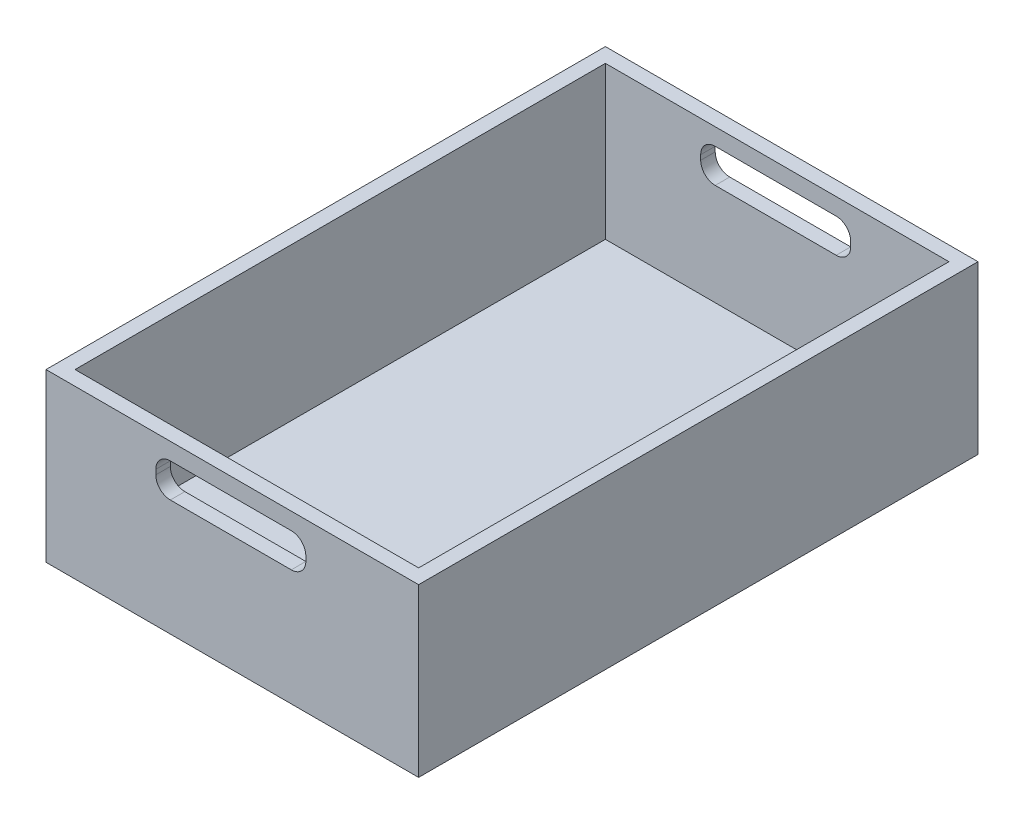
ISO-10303-21;
HEADER;
FILE_DESCRIPTION(('STEP AP214'),'2;1');
FILE_NAME('part.step','',(''),(''),'','','');
FILE_SCHEMA(('AUTOMOTIVE_DESIGN { 1 0 10303 214 1 1 1 1 }'));
ENDSEC;
DATA;
#1=APPLICATION_CONTEXT('core data for automotive mechanical design processes');
#2=APPLICATION_PROTOCOL_DEFINITION('international standard','automotive_design',2000,#1);
#3=PRODUCT_CONTEXT('',#1,'mechanical');
#4=PRODUCT('Part','Part','',(#3));
#5=PRODUCT_RELATED_PRODUCT_CATEGORY('part','',(#4));
#6=PRODUCT_DEFINITION_FORMATION('','',#4);
#7=PRODUCT_DEFINITION_CONTEXT('part definition',#1,'design');
#8=PRODUCT_DEFINITION('design','',#6,#7);
#9=PRODUCT_DEFINITION_SHAPE('','',#8);
#10=(LENGTH_UNIT() NAMED_UNIT(*) SI_UNIT(.MILLI.,.METRE.));
#11=(NAMED_UNIT(*) PLANE_ANGLE_UNIT() SI_UNIT($,.RADIAN.));
#12=(NAMED_UNIT(*) SI_UNIT($,.STERADIAN.) SOLID_ANGLE_UNIT());
#13=UNCERTAINTY_MEASURE_WITH_UNIT(LENGTH_MEASURE(1.E-05),#10,'distance_accuracy_value','');
#14=(GEOMETRIC_REPRESENTATION_CONTEXT(3) GLOBAL_UNCERTAINTY_ASSIGNED_CONTEXT((#13)) GLOBAL_UNIT_ASSIGNED_CONTEXT((#10,
#11,#12)) REPRESENTATION_CONTEXT('',''));
#15=CARTESIAN_POINT('',(0.,0.,0.));
#16=DIRECTION('',(0.,0.,1.));
#17=DIRECTION('',(1.,0.,0.));
#18=AXIS2_PLACEMENT_3D('',#15,#16,#17);
#19=CARTESIAN_POINT('',(0.,15.,0.));
#20=DIRECTION('',(0.,-1.,0.));
#21=DIRECTION('',(0.,0.,-1.));
#22=AXIS2_PLACEMENT_3D('',#19,#20,#21);
#23=PLANE('',#22);
#24=DIRECTION('',(0.,0.,1.));
#25=VECTOR('',#24,1.);
#26=CARTESIAN_POINT('',(177.5,15.,289.));
#27=LINE('',#26,#25);
#28=CARTESIAN_POINT('',(177.5,15.,-274.));
#29=VERTEX_POINT('',#28);
#30=CARTESIAN_POINT('',(177.5,15.,274.));
#31=VERTEX_POINT('',#30);
#32=EDGE_CURVE('E243',#29,#31,#27,.T.);
#33=ORIENTED_EDGE('',*,*,#32,.F.);
#34=DIRECTION('',(-1.,0.,0.));
#35=VECTOR('',#34,1.);
#36=CARTESIAN_POINT('',(-177.5,15.,-274.));
#37=LINE('',#36,#35);
#38=CARTESIAN_POINT('',(-177.5,15.,-274.));
#39=VERTEX_POINT('',#38);
#40=EDGE_CURVE('E218',#29,#39,#37,.T.);
#41=ORIENTED_EDGE('',*,*,#40,.T.);
#42=DIRECTION('',(0.,0.,1.));
#43=VECTOR('',#42,1.);
#44=CARTESIAN_POINT('',(-177.5,15.,289.));
#45=LINE('',#44,#43);
#46=CARTESIAN_POINT('',(-177.5,15.,274.));
#47=VERTEX_POINT('',#46);
#48=EDGE_CURVE('E237',#39,#47,#45,.T.);
#49=ORIENTED_EDGE('',*,*,#48,.T.);
#50=DIRECTION('',(-1.,0.,0.));
#51=VECTOR('',#50,1.);
#52=CARTESIAN_POINT('',(-177.5,15.,274.));
#53=LINE('',#52,#51);
#54=EDGE_CURVE('E225',#31,#47,#53,.T.);
#55=ORIENTED_EDGE('',*,*,#54,.F.);
#56=EDGE_LOOP('',(#33,#41,#49,#55));
#57=FACE_BOUND('',#56,.T.);
#58=ADVANCED_FACE('F33',(#57),#23,.F.);
#59=CARTESIAN_POINT('',(177.5,172.5,289.));
#60=DIRECTION('',(1.,0.,0.));
#61=DIRECTION('',(0.,0.,-1.));
#62=AXIS2_PLACEMENT_3D('',#59,#60,#61);
#63=PLANE('',#62);
#64=DIRECTION('',(0.,0.,1.));
#65=VECTOR('',#64,1.);
#66=CARTESIAN_POINT('',(177.5,172.5,289.));
#67=LINE('',#66,#65);
#68=CARTESIAN_POINT('',(177.5,172.5,-274.));
#69=VERTEX_POINT('',#68);
#70=CARTESIAN_POINT('',(177.5,172.5,274.));
#71=VERTEX_POINT('',#70);
#72=EDGE_CURVE('E250',#69,#71,#67,.T.);
#73=ORIENTED_EDGE('',*,*,#72,.F.);
#74=DIRECTION('',(0.,-1.,0.));
#75=VECTOR('',#74,1.);
#76=CARTESIAN_POINT('',(177.5,172.5,-274.));
#77=LINE('',#76,#75);
#78=EDGE_CURVE('E217',#69,#29,#77,.T.);
#79=ORIENTED_EDGE('',*,*,#78,.T.);
#80=ORIENTED_EDGE('',*,*,#32,.T.);
#81=DIRECTION('',(0.,-1.,0.));
#82=VECTOR('',#81,1.);
#83=CARTESIAN_POINT('',(177.5,172.5,274.));
#84=LINE('',#83,#82);
#85=EDGE_CURVE('E234',#71,#31,#84,.T.);
#86=ORIENTED_EDGE('',*,*,#85,.F.);
#87=EDGE_LOOP('',(#73,#79,#80,#86));
#88=FACE_BOUND('',#87,.T.);
#89=ADVANCED_FACE('F436',(#88),#63,.F.);
#90=CARTESIAN_POINT('',(-177.5,172.5,289.));
#91=DIRECTION('',(1.,0.,0.));
#92=DIRECTION('',(0.,0.,-1.));
#93=AXIS2_PLACEMENT_3D('',#90,#91,#92);
#94=PLANE('',#93);
#95=DIRECTION('',(0.,-1.,0.));
#96=VECTOR('',#95,1.);
#97=CARTESIAN_POINT('',(-177.5,172.5,-274.));
#98=LINE('',#97,#96);
#99=CARTESIAN_POINT('',(-177.5,172.5,-274.));
#100=VERTEX_POINT('',#99);
#101=EDGE_CURVE('E223',#100,#39,#98,.T.);
#102=ORIENTED_EDGE('',*,*,#101,.F.);
#103=DIRECTION('',(0.,0.,1.));
#104=VECTOR('',#103,1.);
#105=CARTESIAN_POINT('',(-177.5,172.5,289.));
#106=LINE('',#105,#104);
#107=CARTESIAN_POINT('',(-177.5,172.5,274.));
#108=VERTEX_POINT('',#107);
#109=EDGE_CURVE('E241',#100,#108,#106,.T.);
#110=ORIENTED_EDGE('',*,*,#109,.T.);
#111=DIRECTION('',(0.,-1.,0.));
#112=VECTOR('',#111,1.);
#113=CARTESIAN_POINT('',(-177.5,172.5,274.));
#114=LINE('',#113,#112);
#115=EDGE_CURVE('E229',#108,#47,#114,.T.);
#116=ORIENTED_EDGE('',*,*,#115,.T.);
#117=ORIENTED_EDGE('',*,*,#48,.F.);
#118=EDGE_LOOP('',(#102,#110,#116,#117));
#119=FACE_BOUND('',#118,.T.);
#120=ADVANCED_FACE('F442',(#119),#94,.T.);
#121=CARTESIAN_POINT('',(192.5,15.,289.));
#122=DIRECTION('',(-1.,0.,0.));
#123=DIRECTION('',(0.,0.,1.));
#124=AXIS2_PLACEMENT_3D('',#121,#122,#123);
#125=PLANE('',#124);
#126=DIRECTION('',(0.,0.,-1.));
#127=VECTOR('',#126,1.);
#128=CARTESIAN_POINT('',(192.5,0.,289.));
#129=LINE('',#128,#127);
#130=CARTESIAN_POINT('',(192.5,0.,289.));
#131=VERTEX_POINT('',#130);
#132=CARTESIAN_POINT('',(192.5,0.,-289.));
#133=VERTEX_POINT('',#132);
#134=EDGE_CURVE('E255',#131,#133,#129,.T.);
#135=ORIENTED_EDGE('',*,*,#134,.T.);
#136=DIRECTION('',(0.,-1.,0.));
#137=VECTOR('',#136,1.);
#138=CARTESIAN_POINT('',(192.5,15.,-289.));
#139=LINE('',#138,#137);
#140=CARTESIAN_POINT('',(192.5,172.5,-289.));
#141=VERTEX_POINT('',#140);
#142=EDGE_CURVE('E274',#141,#133,#139,.T.);
#143=ORIENTED_EDGE('',*,*,#142,.F.);
#144=DIRECTION('',(0.,0.,-1.));
#145=VECTOR('',#144,1.);
#146=CARTESIAN_POINT('',(192.5,172.5,289.));
#147=LINE('',#146,#145);
#148=CARTESIAN_POINT('',(192.5,172.5,289.));
#149=VERTEX_POINT('',#148);
#150=EDGE_CURVE('E245',#149,#141,#147,.T.);
#151=ORIENTED_EDGE('',*,*,#150,.F.);
#152=DIRECTION('',(0.,-1.,0.));
#153=VECTOR('',#152,1.);
#154=CARTESIAN_POINT('',(192.5,15.,289.));
#155=LINE('',#154,#153);
#156=EDGE_CURVE('E265',#149,#131,#155,.T.);
#157=ORIENTED_EDGE('',*,*,#156,.T.);
#158=EDGE_LOOP('',(#135,#143,#151,#157));
#159=FACE_BOUND('',#158,.T.);
#160=ADVANCED_FACE('F35',(#159),#125,.F.);
#161=CARTESIAN_POINT('',(-192.5,15.,-289.));
#162=DIRECTION('',(0.,0.,1.));
#163=DIRECTION('',(1.,0.,0.));
#164=AXIS2_PLACEMENT_3D('',#161,#162,#163);
#165=PLANE('',#164);
#166=DIRECTION('',(0.,1.,0.));
#167=VECTOR('',#166,1.);
#168=CARTESIAN_POINT('',(75.9655531314844,140.,-289.));
#169=LINE('',#168,#167);
#170=CARTESIAN_POINT('',(75.9655531314844,135.,-289.));
#171=VERTEX_POINT('',#170);
#172=CARTESIAN_POINT('',(75.9655531314844,140.,-289.));
#173=VERTEX_POINT('',#172);
#174=EDGE_CURVE('E386',#171,#173,#169,.T.);
#175=ORIENTED_EDGE('',*,*,#174,.T.);
#176=CARTESIAN_POINT('',(60.9655531314844,140.,-289.));
#177=DIRECTION('',(0.,0.,1.));
#178=DIRECTION('',(-1.,0.,0.));
#179=AXIS2_PLACEMENT_3D('',#176,#177,#178);
#180=CIRCLE('',#179,15.);
#181=CARTESIAN_POINT('',(60.9655531314844,155.,-289.));
#182=VERTEX_POINT('',#181);
#183=EDGE_CURVE('E392',#173,#182,#180,.T.);
#184=ORIENTED_EDGE('',*,*,#183,.T.);
#185=DIRECTION('',(-1.,0.,0.));
#186=VECTOR('',#185,1.);
#187=CARTESIAN_POINT('',(-64.0344468685156,155.,-289.));
#188=LINE('',#187,#186);
#189=CARTESIAN_POINT('',(-64.0344468685156,155.,-289.));
#190=VERTEX_POINT('',#189);
#191=EDGE_CURVE('E379',#182,#190,#188,.T.);
#192=ORIENTED_EDGE('',*,*,#191,.T.);
#193=CARTESIAN_POINT('',(-64.0344468685156,140.,-289.));
#194=DIRECTION('',(0.,0.,1.));
#195=DIRECTION('',(1.,0.,0.));
#196=AXIS2_PLACEMENT_3D('',#193,#194,#195);
#197=CIRCLE('',#196,15.);
#198=CARTESIAN_POINT('',(-79.0344468685156,140.,-289.));
#199=VERTEX_POINT('',#198);
#200=EDGE_CURVE('E51',#190,#199,#197,.T.);
#201=ORIENTED_EDGE('',*,*,#200,.T.);
#202=DIRECTION('',(0.,-1.,0.));
#203=VECTOR('',#202,1.);
#204=CARTESIAN_POINT('',(-79.0344468685156,140.,-289.));
#205=LINE('',#204,#203);
#206=CARTESIAN_POINT('',(-79.0344468685156,135.,-289.));
#207=VERTEX_POINT('',#206);
#208=EDGE_CURVE('E373',#199,#207,#205,.T.);
#209=ORIENTED_EDGE('',*,*,#208,.T.);
#210=CARTESIAN_POINT('',(-64.0344468685156,135.,-289.));
#211=DIRECTION('',(0.,0.,1.));
#212=DIRECTION('',(1.,0.,0.));
#213=AXIS2_PLACEMENT_3D('',#210,#211,#212);
#214=CIRCLE('',#213,15.);
#215=CARTESIAN_POINT('',(-64.0344468685156,120.,-289.));
#216=VERTEX_POINT('',#215);
#217=EDGE_CURVE('E364',#207,#216,#214,.T.);
#218=ORIENTED_EDGE('',*,*,#217,.T.);
#219=DIRECTION('',(1.,0.,0.));
#220=VECTOR('',#219,1.);
#221=CARTESIAN_POINT('',(-64.0344468685156,120.,-289.));
#222=LINE('',#221,#220);
#223=CARTESIAN_POINT('',(60.9655531314844,120.,-289.));
#224=VERTEX_POINT('',#223);
#225=EDGE_CURVE('E372',#216,#224,#222,.T.);
#226=ORIENTED_EDGE('',*,*,#225,.T.);
#227=CARTESIAN_POINT('',(60.9655531314844,135.,-289.));
#228=DIRECTION('',(0.,0.,1.));
#229=DIRECTION('',(1.,0.,0.));
#230=AXIS2_PLACEMENT_3D('',#227,#228,#229);
#231=CIRCLE('',#230,15.);
#232=EDGE_CURVE('E384',#224,#171,#231,.T.);
#233=ORIENTED_EDGE('',*,*,#232,.T.);
#234=EDGE_LOOP('',(#175,#184,#192,#201,#209,#218,#226,#233));
#235=FACE_BOUND('',#234,.T.);
#236=DIRECTION('',(-1.,0.,0.));
#237=VECTOR('',#236,1.);
#238=CARTESIAN_POINT('',(-192.5,0.,-289.));
#239=LINE('',#238,#237);
#240=CARTESIAN_POINT('',(-192.5,0.,-289.));
#241=VERTEX_POINT('',#240);
#242=EDGE_CURVE('E259',#133,#241,#239,.T.);
#243=ORIENTED_EDGE('',*,*,#242,.T.);
#244=DIRECTION('',(0.,-1.,0.));
#245=VECTOR('',#244,1.);
#246=CARTESIAN_POINT('',(-192.5,15.,-289.));
#247=LINE('',#246,#245);
#248=CARTESIAN_POINT('',(-192.5,172.5,-289.));
#249=VERTEX_POINT('',#248);
#250=EDGE_CURVE('E271',#249,#241,#247,.T.);
#251=ORIENTED_EDGE('',*,*,#250,.F.);
#252=DIRECTION('',(-1.,0.,0.));
#253=VECTOR('',#252,1.);
#254=CARTESIAN_POINT('',(192.5,172.5,-289.));
#255=LINE('',#254,#253);
#256=EDGE_CURVE('E248',#141,#249,#255,.T.);
#257=ORIENTED_EDGE('',*,*,#256,.F.);
#258=ORIENTED_EDGE('',*,*,#142,.T.);
#259=EDGE_LOOP('',(#243,#251,#257,#258));
#260=FACE_BOUND('',#259,.T.);
#261=ADVANCED_FACE('F376',(#235,#260),#165,.F.);
#262=CARTESIAN_POINT('',(-192.5,15.,289.));
#263=DIRECTION('',(1.,0.,0.));
#264=DIRECTION('',(0.,0.,-1.));
#265=AXIS2_PLACEMENT_3D('',#262,#263,#264);
#266=PLANE('',#265);
#267=DIRECTION('',(0.,0.,1.));
#268=VECTOR('',#267,1.);
#269=CARTESIAN_POINT('',(-192.5,0.,289.));
#270=LINE('',#269,#268);
#271=CARTESIAN_POINT('',(-192.5,0.,289.));
#272=VERTEX_POINT('',#271);
#273=EDGE_CURVE('E261',#241,#272,#270,.T.);
#274=ORIENTED_EDGE('',*,*,#273,.T.);
#275=DIRECTION('',(0.,-1.,0.));
#276=VECTOR('',#275,1.);
#277=CARTESIAN_POINT('',(-192.5,15.,289.));
#278=LINE('',#277,#276);
#279=CARTESIAN_POINT('',(-192.5,172.5,289.));
#280=VERTEX_POINT('',#279);
#281=EDGE_CURVE('E268',#280,#272,#278,.T.);
#282=ORIENTED_EDGE('',*,*,#281,.F.);
#283=DIRECTION('',(0.,0.,-1.));
#284=VECTOR('',#283,1.);
#285=CARTESIAN_POINT('',(-192.5,172.5,289.));
#286=LINE('',#285,#284);
#287=EDGE_CURVE('E238',#280,#249,#286,.T.);
#288=ORIENTED_EDGE('',*,*,#287,.T.);
#289=ORIENTED_EDGE('',*,*,#250,.T.);
#290=EDGE_LOOP('',(#274,#282,#288,#289));
#291=FACE_BOUND('',#290,.T.);
#292=ADVANCED_FACE('F455',(#291),#266,.F.);
#293=CARTESIAN_POINT('',(-192.5,15.,289.));
#294=DIRECTION('',(0.,0.,-1.));
#295=DIRECTION('',(-1.,0.,0.));
#296=AXIS2_PLACEMENT_3D('',#293,#294,#295);
#297=PLANE('',#296);
#298=DIRECTION('',(1.,0.,0.));
#299=VECTOR('',#298,1.);
#300=CARTESIAN_POINT('',(-64.0344468685156,155.,289.));
#301=LINE('',#300,#299);
#302=CARTESIAN_POINT('',(60.9655531314844,155.,289.));
#303=VERTEX_POINT('',#302);
#304=CARTESIAN_POINT('',(-64.0344468685156,155.,289.));
#305=VERTEX_POINT('',#304);
#306=EDGE_CURVE('E171',#303,#305,#301,.F.);
#307=ORIENTED_EDGE('',*,*,#306,.F.);
#308=CARTESIAN_POINT('',(60.9655531314844,140.,289.));
#309=DIRECTION('',(0.,0.,1.));
#310=DIRECTION('',(1.,0.,0.));
#311=AXIS2_PLACEMENT_3D('',#308,#309,#310);
#312=CIRCLE('',#311,15.);
#313=CARTESIAN_POINT('',(75.9655531314844,140.,289.));
#314=VERTEX_POINT('',#313);
#315=EDGE_CURVE('E37',#314,#303,#312,.T.);
#316=ORIENTED_EDGE('',*,*,#315,.F.);
#317=DIRECTION('',(0.,1.,0.));
#318=VECTOR('',#317,1.);
#319=CARTESIAN_POINT('',(75.9655531314844,140.,289.));
#320=LINE('',#319,#318);
#321=CARTESIAN_POINT('',(75.9655531314844,135.,289.));
#322=VERTEX_POINT('',#321);
#323=EDGE_CURVE('E95',#322,#314,#320,.T.);
#324=ORIENTED_EDGE('',*,*,#323,.F.);
#325=CARTESIAN_POINT('',(60.9655531314844,135.,289.));
#326=DIRECTION('',(0.,0.,1.));
#327=DIRECTION('',(1.,0.,0.));
#328=AXIS2_PLACEMENT_3D('',#325,#326,#327);
#329=CIRCLE('',#328,15.);
#330=CARTESIAN_POINT('',(60.9655531314844,120.,289.));
#331=VERTEX_POINT('',#330);
#332=EDGE_CURVE('E211',#331,#322,#329,.T.);
#333=ORIENTED_EDGE('',*,*,#332,.F.);
#334=DIRECTION('',(1.,0.,0.));
#335=VECTOR('',#334,1.);
#336=CARTESIAN_POINT('',(-64.0344468685156,120.,289.));
#337=LINE('',#336,#335);
#338=CARTESIAN_POINT('',(-64.0344468685156,120.,289.));
#339=VERTEX_POINT('',#338);
#340=EDGE_CURVE('E207',#339,#331,#337,.T.);
#341=ORIENTED_EDGE('',*,*,#340,.F.);
#342=CARTESIAN_POINT('',(-64.0344468685156,135.,289.));
#343=DIRECTION('',(0.,0.,1.));
#344=DIRECTION('',(1.,0.,0.));
#345=AXIS2_PLACEMENT_3D('',#342,#343,#344);
#346=CIRCLE('',#345,15.);
#347=CARTESIAN_POINT('',(-79.0344468685156,135.,289.));
#348=VERTEX_POINT('',#347);
#349=EDGE_CURVE('E203',#348,#339,#346,.T.);
#350=ORIENTED_EDGE('',*,*,#349,.F.);
#351=DIRECTION('',(0.,1.,0.));
#352=VECTOR('',#351,1.);
#353=CARTESIAN_POINT('',(-79.0344468685156,140.,289.));
#354=LINE('',#353,#352);
#355=CARTESIAN_POINT('',(-79.0344468685156,140.,289.));
#356=VERTEX_POINT('',#355);
#357=EDGE_CURVE('E199',#356,#348,#354,.F.);
#358=ORIENTED_EDGE('',*,*,#357,.F.);
#359=CARTESIAN_POINT('',(-64.0344468685156,140.,289.));
#360=DIRECTION('',(0.,0.,1.));
#361=DIRECTION('',(1.,0.,0.));
#362=AXIS2_PLACEMENT_3D('',#359,#360,#361);
#363=CIRCLE('',#362,15.);
#364=EDGE_CURVE('E184',#305,#356,#363,.T.);
#365=ORIENTED_EDGE('',*,*,#364,.F.);
#366=EDGE_LOOP('',(#307,#316,#324,#333,#341,#350,#358,#365));
#367=FACE_BOUND('',#366,.T.);
#368=DIRECTION('',(1.,0.,0.));
#369=VECTOR('',#368,1.);
#370=CARTESIAN_POINT('',(-192.5,0.,289.));
#371=LINE('',#370,#369);
#372=EDGE_CURVE('E263',#272,#131,#371,.T.);
#373=ORIENTED_EDGE('',*,*,#372,.T.);
#374=ORIENTED_EDGE('',*,*,#156,.F.);
#375=DIRECTION('',(1.,0.,0.));
#376=VECTOR('',#375,1.);
#377=CARTESIAN_POINT('',(192.5,172.5,289.));
#378=LINE('',#377,#376);
#379=EDGE_CURVE('E252',#280,#149,#378,.T.);
#380=ORIENTED_EDGE('',*,*,#379,.F.);
#381=ORIENTED_EDGE('',*,*,#281,.T.);
#382=EDGE_LOOP('',(#373,#374,#380,#381));
#383=FACE_BOUND('',#382,.T.);
#384=ADVANCED_FACE('F316',(#367,#383),#297,.F.);
#385=CARTESIAN_POINT('',(0.,0.,0.));
#386=DIRECTION('',(0.,-1.,0.));
#387=DIRECTION('',(0.,0.,-1.));
#388=AXIS2_PLACEMENT_3D('',#385,#386,#387);
#389=PLANE('',#388);
#390=ORIENTED_EDGE('',*,*,#134,.F.);
#391=ORIENTED_EDGE('',*,*,#372,.F.);
#392=ORIENTED_EDGE('',*,*,#273,.F.);
#393=ORIENTED_EDGE('',*,*,#242,.F.);
#394=EDGE_LOOP('',(#390,#391,#392,#393));
#395=FACE_BOUND('',#394,.T.);
#396=ADVANCED_FACE('F448',(#395),#389,.T.);
#397=CARTESIAN_POINT('',(0.,172.5,0.));
#398=DIRECTION('',(0.,1.,0.));
#399=DIRECTION('',(0.,0.,1.));
#400=AXIS2_PLACEMENT_3D('',#397,#398,#399);
#401=PLANE('',#400);
#402=ORIENTED_EDGE('',*,*,#109,.F.);
#403=DIRECTION('',(-1.,0.,0.));
#404=VECTOR('',#403,1.);
#405=CARTESIAN_POINT('',(-177.5,172.5,-274.));
#406=LINE('',#405,#404);
#407=EDGE_CURVE('E215',#69,#100,#406,.T.);
#408=ORIENTED_EDGE('',*,*,#407,.F.);
#409=ORIENTED_EDGE('',*,*,#72,.T.);
#410=DIRECTION('',(-1.,0.,0.));
#411=VECTOR('',#410,1.);
#412=CARTESIAN_POINT('',(-177.5,172.5,274.));
#413=LINE('',#412,#411);
#414=EDGE_CURVE('E226',#71,#108,#413,.T.);
#415=ORIENTED_EDGE('',*,*,#414,.T.);
#416=EDGE_LOOP('',(#402,#408,#409,#415));
#417=FACE_BOUND('',#416,.T.);
#418=ORIENTED_EDGE('',*,*,#150,.T.);
#419=ORIENTED_EDGE('',*,*,#256,.T.);
#420=ORIENTED_EDGE('',*,*,#287,.F.);
#421=ORIENTED_EDGE('',*,*,#379,.T.);
#422=EDGE_LOOP('',(#418,#419,#420,#421));
#423=FACE_BOUND('',#422,.T.);
#424=ADVANCED_FACE('F451',(#417,#423),#401,.T.);
#425=CARTESIAN_POINT('',(-177.5,172.5,274.));
#426=DIRECTION('',(0.,0.,1.));
#427=DIRECTION('',(1.,0.,0.));
#428=AXIS2_PLACEMENT_3D('',#425,#426,#427);
#429=PLANE('',#428);
#430=DIRECTION('',(0.,1.,0.));
#431=VECTOR('',#430,1.);
#432=CARTESIAN_POINT('',(75.9655531314843,172.500000000001,274.));
#433=LINE('',#432,#431);
#434=CARTESIAN_POINT('',(75.9655531314844,135.,274.));
#435=VERTEX_POINT('',#434);
#436=CARTESIAN_POINT('',(75.9655531314844,140.,274.));
#437=VERTEX_POINT('',#436);
#438=EDGE_CURVE('E212',#435,#437,#433,.T.);
#439=ORIENTED_EDGE('',*,*,#438,.T.);
#440=CARTESIAN_POINT('',(60.9655531314844,140.,274.));
#441=DIRECTION('',(0.,0.,1.));
#442=DIRECTION('',(1.,0.,0.));
#443=AXIS2_PLACEMENT_3D('',#440,#441,#442);
#444=CIRCLE('',#443,15.);
#445=CARTESIAN_POINT('',(60.9655531314844,155.,274.));
#446=VERTEX_POINT('',#445);
#447=EDGE_CURVE('E105',#437,#446,#444,.T.);
#448=ORIENTED_EDGE('',*,*,#447,.T.);
#449=DIRECTION('',(-1.,0.,0.));
#450=VECTOR('',#449,1.);
#451=CARTESIAN_POINT('',(-177.5,155.,274.));
#452=LINE('',#451,#450);
#453=CARTESIAN_POINT('',(-64.0344468685156,155.,274.));
#454=VERTEX_POINT('',#453);
#455=EDGE_CURVE('E169',#446,#454,#452,.T.);
#456=ORIENTED_EDGE('',*,*,#455,.T.);
#457=CARTESIAN_POINT('',(-64.0344468685156,140.,274.));
#458=DIRECTION('',(0.,0.,1.));
#459=DIRECTION('',(1.,0.,0.));
#460=AXIS2_PLACEMENT_3D('',#457,#458,#459);
#461=CIRCLE('',#460,15.);
#462=CARTESIAN_POINT('',(-79.0344468685156,140.,274.));
#463=VERTEX_POINT('',#462);
#464=EDGE_CURVE('E178',#454,#463,#461,.T.);
#465=ORIENTED_EDGE('',*,*,#464,.T.);
#466=DIRECTION('',(0.,-1.,0.));
#467=VECTOR('',#466,1.);
#468=CARTESIAN_POINT('',(-79.0344468685156,172.5,274.));
#469=LINE('',#468,#467);
#470=CARTESIAN_POINT('',(-79.0344468685156,135.,274.));
#471=VERTEX_POINT('',#470);
#472=EDGE_CURVE('E197',#463,#471,#469,.T.);
#473=ORIENTED_EDGE('',*,*,#472,.T.);
#474=CARTESIAN_POINT('',(-64.0344468685156,135.,274.));
#475=DIRECTION('',(0.,0.,1.));
#476=DIRECTION('',(1.,0.,0.));
#477=AXIS2_PLACEMENT_3D('',#474,#475,#476);
#478=CIRCLE('',#477,15.);
#479=CARTESIAN_POINT('',(-64.0344468685156,120.,274.));
#480=VERTEX_POINT('',#479);
#481=EDGE_CURVE('E200',#471,#480,#478,.T.);
#482=ORIENTED_EDGE('',*,*,#481,.T.);
#483=DIRECTION('',(1.,0.,0.));
#484=VECTOR('',#483,1.);
#485=CARTESIAN_POINT('',(-177.5,120.,274.));
#486=LINE('',#485,#484);
#487=CARTESIAN_POINT('',(60.9655531314844,120.,274.));
#488=VERTEX_POINT('',#487);
#489=EDGE_CURVE('E204',#480,#488,#486,.T.);
#490=ORIENTED_EDGE('',*,*,#489,.T.);
#491=CARTESIAN_POINT('',(60.9655531314844,135.,274.));
#492=DIRECTION('',(0.,0.,1.));
#493=DIRECTION('',(1.,0.,0.));
#494=AXIS2_PLACEMENT_3D('',#491,#492,#493);
#495=CIRCLE('',#494,15.);
#496=EDGE_CURVE('E208',#488,#435,#495,.T.);
#497=ORIENTED_EDGE('',*,*,#496,.T.);
#498=EDGE_LOOP('',(#439,#448,#456,#465,#473,#482,#490,#497));
#499=FACE_BOUND('',#498,.T.);
#500=ORIENTED_EDGE('',*,*,#54,.T.);
#501=ORIENTED_EDGE('',*,*,#115,.F.);
#502=ORIENTED_EDGE('',*,*,#414,.F.);
#503=ORIENTED_EDGE('',*,*,#85,.T.);
#504=EDGE_LOOP('',(#500,#501,#502,#503));
#505=FACE_BOUND('',#504,.T.);
#506=ADVANCED_FACE('F187',(#499,#505),#429,.F.);
#507=CARTESIAN_POINT('',(-177.5,172.5,-274.));
#508=DIRECTION('',(0.,0.,1.));
#509=DIRECTION('',(1.,0.,0.));
#510=AXIS2_PLACEMENT_3D('',#507,#508,#509);
#511=PLANE('',#510);
#512=CARTESIAN_POINT('',(60.9655531314844,140.,-274.));
#513=DIRECTION('',(0.,0.,1.));
#514=DIRECTION('',(1.,0.,0.));
#515=AXIS2_PLACEMENT_3D('',#512,#513,#514);
#516=CIRCLE('',#515,15.);
#517=CARTESIAN_POINT('',(75.9655531314844,140.,-274.));
#518=VERTEX_POINT('',#517);
#519=CARTESIAN_POINT('',(60.9655531314844,155.,-274.));
#520=VERTEX_POINT('',#519);
#521=EDGE_CURVE('E11',#518,#520,#516,.T.);
#522=ORIENTED_EDGE('',*,*,#521,.F.);
#523=DIRECTION('',(0.,1.,0.));
#524=VECTOR('',#523,1.);
#525=CARTESIAN_POINT('',(75.9655531314843,172.500000000001,-274.));
#526=LINE('',#525,#524);
#527=CARTESIAN_POINT('',(75.9655531314844,135.,-274.));
#528=VERTEX_POINT('',#527);
#529=EDGE_CURVE('E43',#528,#518,#526,.T.);
#530=ORIENTED_EDGE('',*,*,#529,.F.);
#531=CARTESIAN_POINT('',(60.9655531314844,135.,-274.));
#532=DIRECTION('',(0.,0.,1.));
#533=DIRECTION('',(1.,0.,0.));
#534=AXIS2_PLACEMENT_3D('',#531,#532,#533);
#535=CIRCLE('',#534,15.);
#536=CARTESIAN_POINT('',(60.9655531314844,120.,-274.));
#537=VERTEX_POINT('',#536);
#538=EDGE_CURVE('E291',#537,#528,#535,.T.);
#539=ORIENTED_EDGE('',*,*,#538,.F.);
#540=DIRECTION('',(1.,0.,0.));
#541=VECTOR('',#540,1.);
#542=CARTESIAN_POINT('',(-177.5,120.,-274.));
#543=LINE('',#542,#541);
#544=CARTESIAN_POINT('',(-64.0344468685156,120.,-274.));
#545=VERTEX_POINT('',#544);
#546=EDGE_CURVE('E288',#545,#537,#543,.T.);
#547=ORIENTED_EDGE('',*,*,#546,.F.);
#548=CARTESIAN_POINT('',(-64.0344468685156,135.,-274.));
#549=DIRECTION('',(0.,0.,1.));
#550=DIRECTION('',(1.,0.,0.));
#551=AXIS2_PLACEMENT_3D('',#548,#549,#550);
#552=CIRCLE('',#551,15.);
#553=CARTESIAN_POINT('',(-79.0344468685156,135.,-274.));
#554=VERTEX_POINT('',#553);
#555=EDGE_CURVE('E285',#554,#545,#552,.T.);
#556=ORIENTED_EDGE('',*,*,#555,.F.);
#557=DIRECTION('',(0.,-1.,0.));
#558=VECTOR('',#557,1.);
#559=CARTESIAN_POINT('',(-79.0344468685156,172.5,-274.));
#560=LINE('',#559,#558);
#561=CARTESIAN_POINT('',(-79.0344468685156,140.,-274.));
#562=VERTEX_POINT('',#561);
#563=EDGE_CURVE('E282',#562,#554,#560,.T.);
#564=ORIENTED_EDGE('',*,*,#563,.F.);
#565=CARTESIAN_POINT('',(-64.0344468685156,140.,-274.));
#566=DIRECTION('',(0.,0.,1.));
#567=DIRECTION('',(1.,0.,0.));
#568=AXIS2_PLACEMENT_3D('',#565,#566,#567);
#569=CIRCLE('',#568,15.);
#570=CARTESIAN_POINT('',(-64.0344468685156,155.,-274.));
#571=VERTEX_POINT('',#570);
#572=EDGE_CURVE('E279',#571,#562,#569,.T.);
#573=ORIENTED_EDGE('',*,*,#572,.F.);
#574=DIRECTION('',(-1.,0.,0.));
#575=VECTOR('',#574,1.);
#576=CARTESIAN_POINT('',(-177.5,155.,-274.));
#577=LINE('',#576,#575);
#578=EDGE_CURVE('E277',#520,#571,#577,.T.);
#579=ORIENTED_EDGE('',*,*,#578,.F.);
#580=EDGE_LOOP('',(#522,#530,#539,#547,#556,#564,#573,#579));
#581=FACE_BOUND('',#580,.T.);
#582=ORIENTED_EDGE('',*,*,#40,.F.);
#583=ORIENTED_EDGE('',*,*,#78,.F.);
#584=ORIENTED_EDGE('',*,*,#407,.T.);
#585=ORIENTED_EDGE('',*,*,#101,.T.);
#586=EDGE_LOOP('',(#582,#583,#584,#585));
#587=FACE_BOUND('',#586,.T.);
#588=ADVANCED_FACE('F350',(#581,#587),#511,.T.);
#589=CARTESIAN_POINT('',(-64.0344468685156,155.,-289.));
#590=DIRECTION('',(0.,1.,0.));
#591=DIRECTION('',(0.,0.,1.));
#592=AXIS2_PLACEMENT_3D('',#589,#590,#591);
#593=PLANE('',#592);
#594=ORIENTED_EDGE('',*,*,#578,.T.);
#595=DIRECTION('',(0.,0.,1.));
#596=VECTOR('',#595,1.);
#597=CARTESIAN_POINT('',(-64.0344468685156,155.,-289.));
#598=LINE('',#597,#596);
#599=EDGE_CURVE('E174',#190,#571,#598,.T.);
#600=ORIENTED_EDGE('',*,*,#599,.F.);
#601=ORIENTED_EDGE('',*,*,#191,.F.);
#602=DIRECTION('',(0.,0.,1.));
#603=VECTOR('',#602,1.);
#604=CARTESIAN_POINT('',(60.9655531314844,155.,-289.));
#605=LINE('',#604,#603);
#606=EDGE_CURVE('E159',#182,#520,#605,.T.);
#607=ORIENTED_EDGE('',*,*,#606,.T.);
#608=EDGE_LOOP('',(#594,#600,#601,#607));
#609=FACE_BOUND('',#608,.T.);
#610=ADVANCED_FACE('F422',(#609),#593,.F.);
#611=CARTESIAN_POINT('',(-64.0344468685156,140.,-289.));
#612=DIRECTION('',(0.,0.,1.));
#613=DIRECTION('',(1.,0.,0.));
#614=AXIS2_PLACEMENT_3D('',#611,#612,#613);
#615=CYLINDRICAL_SURFACE('',#614,15.);
#616=ORIENTED_EDGE('',*,*,#572,.T.);
#617=DIRECTION('',(0.,0.,1.));
#618=VECTOR('',#617,1.);
#619=CARTESIAN_POINT('',(-79.0344468685156,140.,-289.));
#620=LINE('',#619,#618);
#621=EDGE_CURVE('E334',#199,#562,#620,.T.);
#622=ORIENTED_EDGE('',*,*,#621,.F.);
#623=ORIENTED_EDGE('',*,*,#200,.F.);
#624=ORIENTED_EDGE('',*,*,#599,.T.);
#625=EDGE_LOOP('',(#616,#622,#623,#624));
#626=FACE_BOUND('',#625,.T.);
#627=ADVANCED_FACE('F344',(#626),#615,.F.);
#628=CARTESIAN_POINT('',(-79.0344468685156,140.,-289.));
#629=DIRECTION('',(-1.,0.,0.));
#630=DIRECTION('',(0.,0.,1.));
#631=AXIS2_PLACEMENT_3D('',#628,#629,#630);
#632=PLANE('',#631);
#633=ORIENTED_EDGE('',*,*,#563,.T.);
#634=DIRECTION('',(0.,0.,1.));
#635=VECTOR('',#634,1.);
#636=CARTESIAN_POINT('',(-79.0344468685156,135.,-289.));
#637=LINE('',#636,#635);
#638=EDGE_CURVE('E331',#207,#554,#637,.T.);
#639=ORIENTED_EDGE('',*,*,#638,.F.);
#640=ORIENTED_EDGE('',*,*,#208,.F.);
#641=ORIENTED_EDGE('',*,*,#621,.T.);
#642=EDGE_LOOP('',(#633,#639,#640,#641));
#643=FACE_BOUND('',#642,.T.);
#644=ADVANCED_FACE('F356',(#643),#632,.F.);
#645=CARTESIAN_POINT('',(-64.0344468685156,135.,-289.));
#646=DIRECTION('',(0.,0.,1.));
#647=DIRECTION('',(1.,0.,0.));
#648=AXIS2_PLACEMENT_3D('',#645,#646,#647);
#649=CYLINDRICAL_SURFACE('',#648,15.);
#650=ORIENTED_EDGE('',*,*,#555,.T.);
#651=DIRECTION('',(0.,0.,1.));
#652=VECTOR('',#651,1.);
#653=CARTESIAN_POINT('',(-64.0344468685156,120.,-289.));
#654=LINE('',#653,#652);
#655=EDGE_CURVE('E327',#216,#545,#654,.T.);
#656=ORIENTED_EDGE('',*,*,#655,.F.);
#657=ORIENTED_EDGE('',*,*,#217,.F.);
#658=ORIENTED_EDGE('',*,*,#638,.T.);
#659=EDGE_LOOP('',(#650,#656,#657,#658));
#660=FACE_BOUND('',#659,.T.);
#661=ADVANCED_FACE('F361',(#660),#649,.F.);
#662=CARTESIAN_POINT('',(-64.0344468685156,120.,-289.));
#663=DIRECTION('',(0.,-1.,0.));
#664=DIRECTION('',(0.,0.,-1.));
#665=AXIS2_PLACEMENT_3D('',#662,#663,#664);
#666=PLANE('',#665);
#667=ORIENTED_EDGE('',*,*,#546,.T.);
#668=DIRECTION('',(0.,0.,1.));
#669=VECTOR('',#668,1.);
#670=CARTESIAN_POINT('',(60.9655531314844,120.,-289.));
#671=LINE('',#670,#669);
#672=EDGE_CURVE('E313',#224,#537,#671,.T.);
#673=ORIENTED_EDGE('',*,*,#672,.F.);
#674=ORIENTED_EDGE('',*,*,#225,.F.);
#675=ORIENTED_EDGE('',*,*,#655,.T.);
#676=EDGE_LOOP('',(#667,#673,#674,#675));
#677=FACE_BOUND('',#676,.T.);
#678=ADVANCED_FACE('F493',(#677),#666,.F.);
#679=CARTESIAN_POINT('',(60.9655531314844,135.,-289.));
#680=DIRECTION('',(0.,0.,1.));
#681=DIRECTION('',(1.,0.,0.));
#682=AXIS2_PLACEMENT_3D('',#679,#680,#681);
#683=CYLINDRICAL_SURFACE('',#682,15.);
#684=ORIENTED_EDGE('',*,*,#538,.T.);
#685=DIRECTION('',(0.,0.,1.));
#686=VECTOR('',#685,1.);
#687=CARTESIAN_POINT('',(75.9655531314844,135.,-289.));
#688=LINE('',#687,#686);
#689=EDGE_CURVE('E312',#171,#528,#688,.T.);
#690=ORIENTED_EDGE('',*,*,#689,.F.);
#691=ORIENTED_EDGE('',*,*,#232,.F.);
#692=ORIENTED_EDGE('',*,*,#672,.T.);
#693=EDGE_LOOP('',(#684,#690,#691,#692));
#694=FACE_BOUND('',#693,.T.);
#695=ADVANCED_FACE('F418',(#694),#683,.F.);
#696=CARTESIAN_POINT('',(75.9655531314844,140.,-289.));
#697=DIRECTION('',(1.,0.,0.));
#698=DIRECTION('',(0.,1.,0.));
#699=AXIS2_PLACEMENT_3D('',#696,#697,#698);
#700=PLANE('',#699);
#701=ORIENTED_EDGE('',*,*,#529,.T.);
#702=DIRECTION('',(0.,0.,1.));
#703=VECTOR('',#702,1.);
#704=CARTESIAN_POINT('',(75.9655531314844,140.,-289.));
#705=LINE('',#704,#703);
#706=EDGE_CURVE('E189',#173,#518,#705,.T.);
#707=ORIENTED_EDGE('',*,*,#706,.F.);
#708=ORIENTED_EDGE('',*,*,#174,.F.);
#709=ORIENTED_EDGE('',*,*,#689,.T.);
#710=EDGE_LOOP('',(#701,#707,#708,#709));
#711=FACE_BOUND('',#710,.T.);
#712=ADVANCED_FACE('F398',(#711),#700,.F.);
#713=CARTESIAN_POINT('',(60.9655531314844,140.,-289.));
#714=DIRECTION('',(0.,0.,1.));
#715=DIRECTION('',(1.,0.,0.));
#716=AXIS2_PLACEMENT_3D('',#713,#714,#715);
#717=CYLINDRICAL_SURFACE('',#716,15.);
#718=ORIENTED_EDGE('',*,*,#521,.T.);
#719=ORIENTED_EDGE('',*,*,#606,.F.);
#720=ORIENTED_EDGE('',*,*,#183,.F.);
#721=ORIENTED_EDGE('',*,*,#706,.T.);
#722=EDGE_LOOP('',(#718,#719,#720,#721));
#723=FACE_BOUND('',#722,.T.);
#724=ADVANCED_FACE('F420',(#723),#717,.F.);
#725=EDGE_CURVE('E320',#446,#303,#605,.T.);
#726=ORIENTED_EDGE('',*,*,#725,.F.);
#727=ORIENTED_EDGE('',*,*,#447,.F.);
#728=EDGE_CURVE('E193',#437,#314,#705,.T.);
#729=ORIENTED_EDGE('',*,*,#728,.T.);
#730=ORIENTED_EDGE('',*,*,#315,.T.);
#731=EDGE_LOOP('',(#726,#727,#729,#730));
#732=FACE_BOUND('',#731,.T.);
#733=ADVANCED_FACE('F319',(#732),#717,.F.);
#734=ORIENTED_EDGE('',*,*,#728,.F.);
#735=ORIENTED_EDGE('',*,*,#438,.F.);
#736=EDGE_CURVE('E305',#435,#322,#688,.T.);
#737=ORIENTED_EDGE('',*,*,#736,.T.);
#738=ORIENTED_EDGE('',*,*,#323,.T.);
#739=EDGE_LOOP('',(#734,#735,#737,#738));
#740=FACE_BOUND('',#739,.T.);
#741=ADVANCED_FACE('F311',(#740),#700,.F.);
#742=ORIENTED_EDGE('',*,*,#736,.F.);
#743=ORIENTED_EDGE('',*,*,#496,.F.);
#744=EDGE_CURVE('E307',#488,#331,#671,.T.);
#745=ORIENTED_EDGE('',*,*,#744,.T.);
#746=ORIENTED_EDGE('',*,*,#332,.T.);
#747=EDGE_LOOP('',(#742,#743,#745,#746));
#748=FACE_BOUND('',#747,.T.);
#749=ADVANCED_FACE('F303',(#748),#683,.F.);
#750=ORIENTED_EDGE('',*,*,#744,.F.);
#751=ORIENTED_EDGE('',*,*,#489,.F.);
#752=EDGE_CURVE('E330',#480,#339,#654,.T.);
#753=ORIENTED_EDGE('',*,*,#752,.T.);
#754=ORIENTED_EDGE('',*,*,#340,.T.);
#755=EDGE_LOOP('',(#750,#751,#753,#754));
#756=FACE_BOUND('',#755,.T.);
#757=ADVANCED_FACE('F499',(#756),#666,.F.);
#758=ORIENTED_EDGE('',*,*,#752,.F.);
#759=ORIENTED_EDGE('',*,*,#481,.F.);
#760=EDGE_CURVE('E333',#471,#348,#637,.T.);
#761=ORIENTED_EDGE('',*,*,#760,.T.);
#762=ORIENTED_EDGE('',*,*,#349,.T.);
#763=EDGE_LOOP('',(#758,#759,#761,#762));
#764=FACE_BOUND('',#763,.T.);
#765=ADVANCED_FACE('F503',(#764),#649,.F.);
#766=ORIENTED_EDGE('',*,*,#760,.F.);
#767=ORIENTED_EDGE('',*,*,#472,.F.);
#768=EDGE_CURVE('E181',#463,#356,#620,.T.);
#769=ORIENTED_EDGE('',*,*,#768,.T.);
#770=ORIENTED_EDGE('',*,*,#357,.T.);
#771=EDGE_LOOP('',(#766,#767,#769,#770));
#772=FACE_BOUND('',#771,.T.);
#773=ADVANCED_FACE('F512',(#772),#632,.F.);
#774=ORIENTED_EDGE('',*,*,#768,.F.);
#775=ORIENTED_EDGE('',*,*,#464,.F.);
#776=EDGE_CURVE('E164',#454,#305,#598,.T.);
#777=ORIENTED_EDGE('',*,*,#776,.T.);
#778=ORIENTED_EDGE('',*,*,#364,.T.);
#779=EDGE_LOOP('',(#774,#775,#777,#778));
#780=FACE_BOUND('',#779,.T.);
#781=ADVANCED_FACE('F179',(#780),#615,.F.);
#782=ORIENTED_EDGE('',*,*,#776,.F.);
#783=ORIENTED_EDGE('',*,*,#455,.F.);
#784=ORIENTED_EDGE('',*,*,#725,.T.);
#785=ORIENTED_EDGE('',*,*,#306,.T.);
#786=EDGE_LOOP('',(#782,#783,#784,#785));
#787=FACE_BOUND('',#786,.T.);
#788=ADVANCED_FACE('F166',(#787),#593,.F.);
#789=CLOSED_SHELL('',(#58,#89,#120,#160,#261,#292,#384,#396,#424,#506,#588,#610,#627,#644,#661,
#678,#695,#712,#724,#733,#741,#749,#757,#765,#773,#781,#788));
#790=MANIFOLD_SOLID_BREP('B2',#789);
#791=ADVANCED_BREP_SHAPE_REPRESENTATION('',(#18,#790),#14);
#792=SHAPE_DEFINITION_REPRESENTATION(#9,#791);
ENDSEC;
END-ISO-10303-21;
